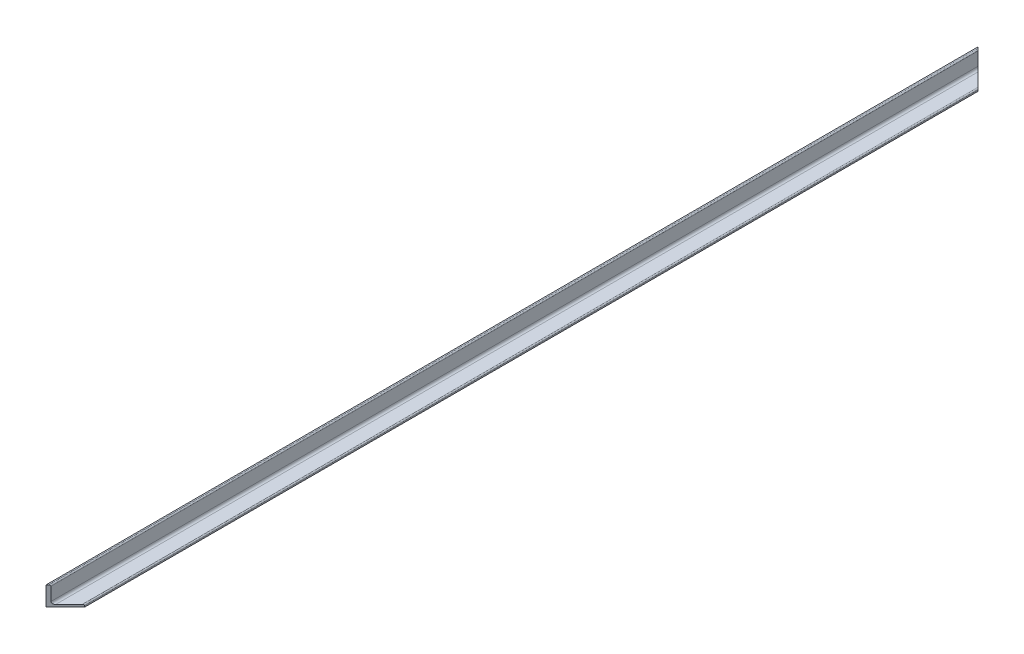
ISO-10303-21;
HEADER;
FILE_DESCRIPTION(('STEP AP214'),'2;1');
FILE_NAME('part.step','',(''),(''),'','','');
FILE_SCHEMA(('AUTOMOTIVE_DESIGN { 1 0 10303 214 1 1 1 1 }'));
ENDSEC;
DATA;
#1=APPLICATION_CONTEXT('core data for automotive mechanical design processes');
#2=APPLICATION_PROTOCOL_DEFINITION('international standard','automotive_design',2000,#1);
#3=PRODUCT_CONTEXT('',#1,'mechanical');
#4=PRODUCT('Part','Part','',(#3));
#5=PRODUCT_RELATED_PRODUCT_CATEGORY('part','',(#4));
#6=PRODUCT_DEFINITION_FORMATION('','',#4);
#7=PRODUCT_DEFINITION_CONTEXT('part definition',#1,'design');
#8=PRODUCT_DEFINITION('design','',#6,#7);
#9=PRODUCT_DEFINITION_SHAPE('','',#8);
#10=(LENGTH_UNIT() NAMED_UNIT(*) SI_UNIT(.MILLI.,.METRE.));
#11=(NAMED_UNIT(*) PLANE_ANGLE_UNIT() SI_UNIT($,.RADIAN.));
#12=(NAMED_UNIT(*) SI_UNIT($,.STERADIAN.) SOLID_ANGLE_UNIT());
#13=UNCERTAINTY_MEASURE_WITH_UNIT(LENGTH_MEASURE(1.E-05),#10,'distance_accuracy_value','');
#14=(GEOMETRIC_REPRESENTATION_CONTEXT(3) GLOBAL_UNCERTAINTY_ASSIGNED_CONTEXT((#13)) GLOBAL_UNIT_ASSIGNED_CONTEXT((#10,
#11,#12)) REPRESENTATION_CONTEXT('',''));
#15=CARTESIAN_POINT('',(0.,0.,0.));
#16=DIRECTION('',(0.,0.,1.));
#17=DIRECTION('',(1.,0.,0.));
#18=AXIS2_PLACEMENT_3D('',#15,#16,#17);
#19=CARTESIAN_POINT('',(-4.99999762E-08,0.,4.99999762E-08));
#20=DIRECTION('',(-0.707106781186548,0.,0.707106781186547));
#21=DIRECTION('',(0.707106781186547,0.,0.707106781186548));
#22=AXIS2_PLACEMENT_3D('',#19,#20,#21);
#23=PLANE('',#22);
#24=DIRECTION('',(-0.707106781186547,0.,-0.707106781186548));
#25=VECTOR('',#24,1.);
#26=CARTESIAN_POINT('',(2.4765,38.1,2.47650009999995));
#27=LINE('',#26,#25);
#28=CARTESIAN_POINT('',(2.4765,38.1,2.47650009999995));
#29=VERTEX_POINT('',#28);
#30=CARTESIAN_POINT('',(-1.22995647925761E-08,38.1,3.33697511718237E-08));
#31=VERTEX_POINT('',#30);
#32=EDGE_CURVE('E34',#29,#31,#27,.T.);
#33=ORIENTED_EDGE('',*,*,#32,.F.);
#34=CARTESIAN_POINT('',(2.4765,35.814,2.47650009999995));
#35=DIRECTION('',(-0.707106781186548,0.,0.707106781186548));
#36=DIRECTION('',(-0.707106781186548,0.,-0.707106781186548));
#37=AXIS2_PLACEMENT_3D('',#34,#35,#36);
#38=ELLIPSE('',#37,3.23289220358491,2.286);
#39=CARTESIAN_POINT('',(4.7625,35.814,4.76250009999995));
#40=VERTEX_POINT('',#39);
#41=EDGE_CURVE('E130',#40,#29,#38,.T.);
#42=ORIENTED_EDGE('',*,*,#41,.F.);
#43=DIRECTION('',(0.,1.,0.));
#44=VECTOR('',#43,1.);
#45=CARTESIAN_POINT('',(4.7625,9.5885,4.76250009999998));
#46=LINE('',#45,#44);
#47=CARTESIAN_POINT('',(4.7625,9.5885,4.76250009999998));
#48=VERTEX_POINT('',#47);
#49=EDGE_CURVE('E137',#48,#40,#46,.T.);
#50=ORIENTED_EDGE('',*,*,#49,.F.);
#51=CARTESIAN_POINT('',(9.5885,9.5885,9.58850009999998));
#52=DIRECTION('',(0.707106781186548,0.,-0.707106781186548));
#53=DIRECTION('',(-0.707106781186548,0.,-0.707106781186548));
#54=AXIS2_PLACEMENT_3D('',#51,#52,#53);
#55=ELLIPSE('',#54,6.82499465201256,4.826);
#56=CARTESIAN_POINT('',(9.5885,4.7625,9.58850009999998));
#57=VERTEX_POINT('',#56);
#58=EDGE_CURVE('E144',#57,#48,#55,.T.);
#59=ORIENTED_EDGE('',*,*,#58,.F.);
#60=DIRECTION('',(-0.707106781186547,0.,-0.707106781186548));
#61=VECTOR('',#60,1.);
#62=CARTESIAN_POINT('',(35.814,4.7625,35.8140001));
#63=LINE('',#62,#61);
#64=CARTESIAN_POINT('',(35.814,4.7625,35.8140001));
#65=VERTEX_POINT('',#64);
#66=EDGE_CURVE('E26',#65,#57,#63,.T.);
#67=ORIENTED_EDGE('',*,*,#66,.F.);
#68=CARTESIAN_POINT('',(35.814,2.47650000000003,35.8140001));
#69=DIRECTION('',(-0.707106781186548,0.,0.707106781186547));
#70=DIRECTION('',(-0.707106781186547,0.,-0.707106781186548));
#71=AXIS2_PLACEMENT_3D('',#68,#69,#70);
#72=ELLIPSE('',#71,3.23289220358491,2.286);
#73=CARTESIAN_POINT('',(38.1,2.47650000000003,38.1000001));
#74=VERTEX_POINT('',#73);
#75=EDGE_CURVE('E123',#74,#65,#72,.T.);
#76=ORIENTED_EDGE('',*,*,#75,.F.);
#77=DIRECTION('',(0.,1.,0.));
#78=VECTOR('',#77,1.);
#79=CARTESIAN_POINT('',(38.1,0.,38.1000001));
#80=LINE('',#79,#78);
#81=CARTESIAN_POINT('',(38.1,0.,38.1000001));
#82=VERTEX_POINT('',#81);
#83=EDGE_CURVE('E102',#82,#74,#80,.T.);
#84=ORIENTED_EDGE('',*,*,#83,.F.);
#85=DIRECTION('',(0.707106781186547,0.,0.707106781186548));
#86=VECTOR('',#85,1.);
#87=CARTESIAN_POINT('',(-4.99999773102231E-08,0.,4.99999750897769E-08));
#88=LINE('',#87,#86);
#89=CARTESIAN_POINT('',(-1.2299562351499E-08,0.,3.33697530782527E-08));
#90=VERTEX_POINT('',#89);
#91=EDGE_CURVE('E95',#90,#82,#88,.T.);
#92=ORIENTED_EDGE('',*,*,#91,.F.);
#93=DIRECTION('',(0.,1.,0.));
#94=VECTOR('',#93,1.);
#95=CARTESIAN_POINT('',(0.,0.,0.));
#96=LINE('',#95,#94);
#97=EDGE_CURVE('E10',#90,#31,#96,.T.);
#98=ORIENTED_EDGE('',*,*,#97,.T.);
#99=EDGE_LOOP('',(#33,#42,#50,#59,#67,#76,#84,#92,#98));
#100=FACE_BOUND('',#99,.T.);
#101=ADVANCED_FACE('F16',(#100),#23,.F.);
#102=CARTESIAN_POINT('',(9.5885,4.7625,0.));
#103=DIRECTION('',(0.,1.,0.));
#104=DIRECTION('',(0.,0.,1.));
#105=AXIS2_PLACEMENT_3D('',#102,#103,#104);
#106=PLANE('',#105);
#107=ORIENTED_EDGE('',*,*,#66,.T.);
#108=DIRECTION('',(0.,0.,1.));
#109=VECTOR('',#108,1.);
#110=CARTESIAN_POINT('',(9.5885,4.7625,9.58850009999998));
#111=LINE('',#110,#109);
#112=CARTESIAN_POINT('',(9.5885,4.7625,1831.9114999));
#113=VERTEX_POINT('',#112);
#114=EDGE_CURVE('E148',#57,#113,#111,.T.);
#115=ORIENTED_EDGE('',*,*,#114,.T.);
#116=DIRECTION('',(0.707106781186548,0.,-0.707106781186547));
#117=VECTOR('',#116,1.);
#118=CARTESIAN_POINT('',(9.58850000000006,4.7625,1831.9114999));
#119=LINE('',#118,#117);
#120=CARTESIAN_POINT('',(35.814,4.7625,1805.6859999));
#121=VERTEX_POINT('',#120);
#122=EDGE_CURVE('E146',#113,#121,#119,.T.);
#123=ORIENTED_EDGE('',*,*,#122,.T.);
#124=DIRECTION('',(0.,0.,1.));
#125=VECTOR('',#124,1.);
#126=CARTESIAN_POINT('',(35.814,4.7625,35.8140001));
#127=LINE('',#126,#125);
#128=EDGE_CURVE('E100',#65,#121,#127,.T.);
#129=ORIENTED_EDGE('',*,*,#128,.F.);
#130=EDGE_LOOP('',(#107,#115,#123,#129));
#131=FACE_BOUND('',#130,.T.);
#132=ADVANCED_FACE('F179',(#131),#106,.T.);
#133=CARTESIAN_POINT('',(9.5885,9.5885,0.));
#134=DIRECTION('',(0.,0.,1.));
#135=DIRECTION('',(1.,0.,0.));
#136=AXIS2_PLACEMENT_3D('',#133,#134,#135);
#137=CYLINDRICAL_SURFACE('',#136,4.826);
#138=ORIENTED_EDGE('',*,*,#58,.T.);
#139=DIRECTION('',(0.,0.,1.));
#140=VECTOR('',#139,1.);
#141=CARTESIAN_POINT('',(4.7625,9.5885,4.76250009999998));
#142=LINE('',#141,#140);
#143=CARTESIAN_POINT('',(4.7625,9.5885,1836.7374999));
#144=VERTEX_POINT('',#143);
#145=EDGE_CURVE('E141',#48,#144,#142,.T.);
#146=ORIENTED_EDGE('',*,*,#145,.T.);
#147=CARTESIAN_POINT('',(9.5885,9.5885,1831.9114999));
#148=DIRECTION('',(0.707106781186547,0.,0.707106781186548));
#149=DIRECTION('',(-0.707106781186548,0.,0.707106781186547));
#150=AXIS2_PLACEMENT_3D('',#147,#148,#149);
#151=ELLIPSE('',#150,6.82499465201256,4.826);
#152=EDGE_CURVE('E138',#144,#113,#151,.T.);
#153=ORIENTED_EDGE('',*,*,#152,.T.);
#154=ORIENTED_EDGE('',*,*,#114,.F.);
#155=EDGE_LOOP('',(#138,#146,#153,#154));
#156=FACE_BOUND('',#155,.T.);
#157=ADVANCED_FACE('F175',(#156),#137,.F.);
#158=CARTESIAN_POINT('',(4.7625,35.814,0.));
#159=DIRECTION('',(1.,0.,0.));
#160=DIRECTION('',(0.,0.,-1.));
#161=AXIS2_PLACEMENT_3D('',#158,#159,#160);
#162=PLANE('',#161);
#163=ORIENTED_EDGE('',*,*,#49,.T.);
#164=DIRECTION('',(0.,0.,1.));
#165=VECTOR('',#164,1.);
#166=CARTESIAN_POINT('',(4.7625,35.814,4.76250009999995));
#167=LINE('',#166,#165);
#168=CARTESIAN_POINT('',(4.7625,35.814,1836.7374999));
#169=VERTEX_POINT('',#168);
#170=EDGE_CURVE('E134',#40,#169,#167,.T.);
#171=ORIENTED_EDGE('',*,*,#170,.T.);
#172=DIRECTION('',(0.,-1.,0.));
#173=VECTOR('',#172,1.);
#174=CARTESIAN_POINT('',(4.76249999999992,35.814,1836.7374999));
#175=LINE('',#174,#173);
#176=EDGE_CURVE('E131',#169,#144,#175,.T.);
#177=ORIENTED_EDGE('',*,*,#176,.T.);
#178=ORIENTED_EDGE('',*,*,#145,.F.);
#179=EDGE_LOOP('',(#163,#171,#177,#178));
#180=FACE_BOUND('',#179,.T.);
#181=ADVANCED_FACE('F173',(#180),#162,.T.);
#182=CARTESIAN_POINT('',(2.4765,35.814,0.));
#183=DIRECTION('',(0.,0.,1.));
#184=DIRECTION('',(1.,0.,0.));
#185=AXIS2_PLACEMENT_3D('',#182,#183,#184);
#186=CYLINDRICAL_SURFACE('',#185,2.286);
#187=ORIENTED_EDGE('',*,*,#41,.T.);
#188=DIRECTION('',(0.,0.,1.));
#189=VECTOR('',#188,1.);
#190=CARTESIAN_POINT('',(2.4765,38.1,2.47650009999995));
#191=LINE('',#190,#189);
#192=CARTESIAN_POINT('',(2.4765,38.1,1839.0234999));
#193=VERTEX_POINT('',#192);
#194=EDGE_CURVE('E127',#29,#193,#191,.T.);
#195=ORIENTED_EDGE('',*,*,#194,.T.);
#196=CARTESIAN_POINT('',(2.4765,35.814,1839.0234999));
#197=DIRECTION('',(-0.707106781186547,0.,-0.707106781186548));
#198=DIRECTION('',(-0.707106781186548,0.,0.707106781186547));
#199=AXIS2_PLACEMENT_3D('',#196,#197,#198);
#200=ELLIPSE('',#199,3.23289220358488,2.286);
#201=EDGE_CURVE('E124',#193,#169,#200,.T.);
#202=ORIENTED_EDGE('',*,*,#201,.T.);
#203=ORIENTED_EDGE('',*,*,#170,.F.);
#204=EDGE_LOOP('',(#187,#195,#202,#203));
#205=FACE_BOUND('',#204,.T.);
#206=ADVANCED_FACE('F170',(#205),#186,.T.);
#207=CARTESIAN_POINT('',(920.74999995,0.,920.749999950001));
#208=DIRECTION('',(-0.707106781186547,0.,-0.707106781186548));
#209=DIRECTION('',(-0.707106781186548,0.,0.707106781186547));
#210=AXIS2_PLACEMENT_3D('',#207,#208,#209);
#211=PLANE('',#210);
#212=ORIENTED_EDGE('',*,*,#122,.F.);
#213=ORIENTED_EDGE('',*,*,#152,.F.);
#214=ORIENTED_EDGE('',*,*,#176,.F.);
#215=ORIENTED_EDGE('',*,*,#201,.F.);
#216=DIRECTION('',(0.70710678118656,0.,-0.707106781186535));
#217=VECTOR('',#216,1.);
#218=CARTESIAN_POINT('',(-4.99996833992938E-08,38.1,1841.49999995));
#219=LINE('',#218,#217);
#220=CARTESIAN_POINT('',(-1.22994821099361E-08,38.1,1841.49999996663));
#221=VERTEX_POINT('',#220);
#222=EDGE_CURVE('E120',#221,#193,#219,.T.);
#223=ORIENTED_EDGE('',*,*,#222,.F.);
#224=DIRECTION('',(0.,1.,0.));
#225=VECTOR('',#224,1.);
#226=CARTESIAN_POINT('',(0.,0.,1841.5));
#227=LINE('',#226,#225);
#228=CARTESIAN_POINT('',(-1.22994294378861E-08,0.,1841.49999996663));
#229=VERTEX_POINT('',#228);
#230=EDGE_CURVE('E114',#229,#221,#227,.T.);
#231=ORIENTED_EDGE('',*,*,#230,.F.);
#232=DIRECTION('',(-0.707106781186554,0.,0.707106781186541));
#233=VECTOR('',#232,1.);
#234=CARTESIAN_POINT('',(38.1000000000007,0.,1803.3999999));
#235=LINE('',#234,#233);
#236=CARTESIAN_POINT('',(38.1,0.,1803.3999999));
#237=VERTEX_POINT('',#236);
#238=EDGE_CURVE('E83',#237,#229,#235,.T.);
#239=ORIENTED_EDGE('',*,*,#238,.F.);
#240=DIRECTION('',(0.,-1.,0.));
#241=VECTOR('',#240,1.);
#242=CARTESIAN_POINT('',(38.0999999999999,2.47650000000003,1803.3999999));
#243=LINE('',#242,#241);
#244=CARTESIAN_POINT('',(38.1,2.47650000000003,1803.3999999));
#245=VERTEX_POINT('',#244);
#246=EDGE_CURVE('E86',#245,#237,#243,.T.);
#247=ORIENTED_EDGE('',*,*,#246,.F.);
#248=CARTESIAN_POINT('',(35.814,2.47650000000003,1805.6859999));
#249=DIRECTION('',(-0.707106781186547,0.,-0.707106781186548));
#250=DIRECTION('',(-0.707106781186548,0.,0.707106781186547));
#251=AXIS2_PLACEMENT_3D('',#248,#249,#250);
#252=ELLIPSE('',#251,3.23289220358491,2.286);
#253=EDGE_CURVE('E89',#121,#245,#252,.T.);
#254=ORIENTED_EDGE('',*,*,#253,.F.);
#255=EDGE_LOOP('',(#212,#213,#214,#215,#223,#231,#239,#247,#254));
#256=FACE_BOUND('',#255,.T.);
#257=ADVANCED_FACE('F88',(#256),#211,.F.);
#258=CARTESIAN_POINT('',(0.,38.1,0.));
#259=DIRECTION('',(0.,1.,0.));
#260=DIRECTION('',(0.,0.,1.));
#261=AXIS2_PLACEMENT_3D('',#258,#259,#260);
#262=PLANE('',#261);
#263=ORIENTED_EDGE('',*,*,#32,.T.);
#264=DIRECTION('',(0.,0.,1.));
#265=VECTOR('',#264,1.);
#266=CARTESIAN_POINT('',(0.,38.1,0.));
#267=LINE('',#266,#265);
#268=EDGE_CURVE('E110',#31,#221,#267,.T.);
#269=ORIENTED_EDGE('',*,*,#268,.T.);
#270=ORIENTED_EDGE('',*,*,#222,.T.);
#271=ORIENTED_EDGE('',*,*,#194,.F.);
#272=EDGE_LOOP('',(#263,#269,#270,#271));
#273=FACE_BOUND('',#272,.T.);
#274=ADVANCED_FACE('F163',(#273),#262,.T.);
#275=CARTESIAN_POINT('',(35.814,2.47650000000003,0.));
#276=DIRECTION('',(0.,0.,1.));
#277=DIRECTION('',(1.,0.,0.));
#278=AXIS2_PLACEMENT_3D('',#275,#276,#277);
#279=CYLINDRICAL_SURFACE('',#278,2.286);
#280=ORIENTED_EDGE('',*,*,#75,.T.);
#281=ORIENTED_EDGE('',*,*,#128,.T.);
#282=ORIENTED_EDGE('',*,*,#253,.T.);
#283=DIRECTION('',(0.,0.,1.));
#284=VECTOR('',#283,1.);
#285=CARTESIAN_POINT('',(38.1,2.47650000000003,38.1000001));
#286=LINE('',#285,#284);
#287=EDGE_CURVE('E94',#74,#245,#286,.T.);
#288=ORIENTED_EDGE('',*,*,#287,.F.);
#289=EDGE_LOOP('',(#280,#281,#282,#288));
#290=FACE_BOUND('',#289,.T.);
#291=ADVANCED_FACE('F18',(#290),#279,.T.);
#292=CARTESIAN_POINT('',(38.1,2.47650000000003,0.));
#293=DIRECTION('',(1.,0.,0.));
#294=DIRECTION('',(0.,0.,-1.));
#295=AXIS2_PLACEMENT_3D('',#292,#293,#294);
#296=PLANE('',#295);
#297=ORIENTED_EDGE('',*,*,#83,.T.);
#298=ORIENTED_EDGE('',*,*,#287,.T.);
#299=ORIENTED_EDGE('',*,*,#246,.T.);
#300=DIRECTION('',(0.,0.,1.));
#301=VECTOR('',#300,1.);
#302=CARTESIAN_POINT('',(38.1,0.,38.1000001));
#303=LINE('',#302,#301);
#304=EDGE_CURVE('E111',#82,#237,#303,.T.);
#305=ORIENTED_EDGE('',*,*,#304,.F.);
#306=EDGE_LOOP('',(#297,#298,#299,#305));
#307=FACE_BOUND('',#306,.T.);
#308=ADVANCED_FACE('F104',(#307),#296,.T.);
#309=CARTESIAN_POINT('',(38.1,0.,0.));
#310=DIRECTION('',(0.,-1.,0.));
#311=DIRECTION('',(0.,0.,-1.));
#312=AXIS2_PLACEMENT_3D('',#309,#310,#311);
#313=PLANE('',#312);
#314=ORIENTED_EDGE('',*,*,#91,.T.);
#315=ORIENTED_EDGE('',*,*,#304,.T.);
#316=ORIENTED_EDGE('',*,*,#238,.T.);
#317=DIRECTION('',(0.,0.,1.));
#318=VECTOR('',#317,1.);
#319=CARTESIAN_POINT('',(0.,0.,0.));
#320=LINE('',#319,#318);
#321=EDGE_CURVE('E20',#90,#229,#320,.T.);
#322=ORIENTED_EDGE('',*,*,#321,.F.);
#323=EDGE_LOOP('',(#314,#315,#316,#322));
#324=FACE_BOUND('',#323,.T.);
#325=ADVANCED_FACE('F198',(#324),#313,.T.);
#326=CARTESIAN_POINT('',(0.,0.,0.));
#327=DIRECTION('',(-1.,0.,0.));
#328=DIRECTION('',(0.,0.,1.));
#329=AXIS2_PLACEMENT_3D('',#326,#327,#328);
#330=PLANE('',#329);
#331=ORIENTED_EDGE('',*,*,#230,.T.);
#332=ORIENTED_EDGE('',*,*,#268,.F.);
#333=ORIENTED_EDGE('',*,*,#97,.F.);
#334=ORIENTED_EDGE('',*,*,#321,.T.);
#335=EDGE_LOOP('',(#331,#332,#333,#334));
#336=FACE_BOUND('',#335,.T.);
#337=ADVANCED_FACE('F167',(#336),#330,.T.);
#338=CLOSED_SHELL('',(#101,#132,#157,#181,#206,#257,#274,#291,#308,#325,#337));
#339=MANIFOLD_SOLID_BREP('B1',#338);
#340=ADVANCED_BREP_SHAPE_REPRESENTATION('',(#18,#339),#14);
#341=SHAPE_DEFINITION_REPRESENTATION(#9,#340);
ENDSEC;
END-ISO-10303-21;
